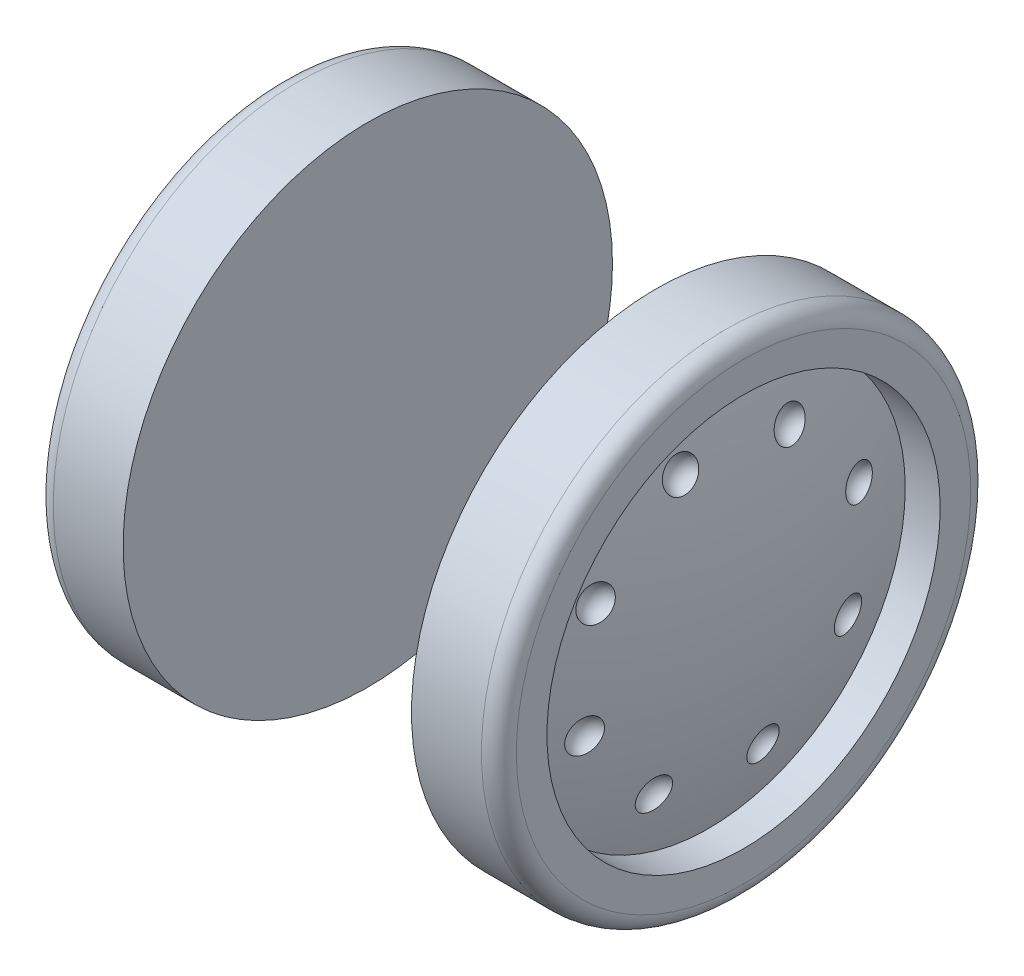
ISO-10303-21;
HEADER;
FILE_DESCRIPTION(('STEP AP214'),'2;1');
FILE_NAME('part.step','',(''),(''),'','','');
FILE_SCHEMA(('AUTOMOTIVE_DESIGN { 1 0 10303 214 1 1 1 1 }'));
ENDSEC;
DATA;
#1=APPLICATION_CONTEXT('core data for automotive mechanical design processes');
#2=APPLICATION_PROTOCOL_DEFINITION('international standard','automotive_design',2000,#1);
#3=PRODUCT_CONTEXT('',#1,'mechanical');
#4=PRODUCT('Part','Part','',(#3));
#5=PRODUCT_RELATED_PRODUCT_CATEGORY('part','',(#4));
#6=PRODUCT_DEFINITION_FORMATION('','',#4);
#7=PRODUCT_DEFINITION_CONTEXT('part definition',#1,'design');
#8=PRODUCT_DEFINITION('design','',#6,#7);
#9=PRODUCT_DEFINITION_SHAPE('','',#8);
#10=(LENGTH_UNIT() NAMED_UNIT(*) SI_UNIT(.MILLI.,.METRE.));
#11=(NAMED_UNIT(*) PLANE_ANGLE_UNIT() SI_UNIT($,.RADIAN.));
#12=(NAMED_UNIT(*) SI_UNIT($,.STERADIAN.) SOLID_ANGLE_UNIT());
#13=UNCERTAINTY_MEASURE_WITH_UNIT(LENGTH_MEASURE(1.E-05),#10,'distance_accuracy_value','');
#14=(GEOMETRIC_REPRESENTATION_CONTEXT(3) GLOBAL_UNCERTAINTY_ASSIGNED_CONTEXT((#13)) GLOBAL_UNIT_ASSIGNED_CONTEXT((#10,
#11,#12)) REPRESENTATION_CONTEXT('',''));
#15=CARTESIAN_POINT('',(0.,0.,0.));
#16=DIRECTION('',(0.,0.,1.));
#17=DIRECTION('',(1.,0.,0.));
#18=AXIS2_PLACEMENT_3D('',#15,#16,#17);
#19=CARTESIAN_POINT('',(-37.8646186680398,-132.5,29.25));
#20=DIRECTION('',(-1.,0.,0.));
#21=DIRECTION('',(0.,0.,-1.));
#22=AXIS2_PLACEMENT_3D('',#19,#20,#21);
#23=SPHERICAL_SURFACE('',#22,40.);
#24=CARTESIAN_POINT('',(-77.0034780050945,-124.64806799323,31.6080273950078));
#25=DIRECTION('',(0.978757983461045,-0.196355777030629,-0.0589679458516745));
#26=DIRECTION('',(0.196698055907386,0.980464111939981,0.));
#27=AXIS2_PLACEMENT_3D('',#24,#25,#26);
#28=CIRCLE('',#27,0.967760486738334);
#29=CARTESIAN_POINT('',(-76.8131213987691,-123.699213567029,31.6080273950078));
#30=VERTEX_POINT('',#29);
#31=EDGE_CURVE('E73',#30,#30,#28,.F.);
#32=ORIENTED_EDGE('',*,*,#31,.F.);
#33=EDGE_LOOP('',(#32));
#34=FACE_BOUND('',#33,.T.);
#35=CARTESIAN_POINT('',(-77.0034780050945,-136.384777206169,22.0304684713632));
#36=DIRECTION('',(0.978757983461045,0.0971478670791499,0.180541135847873));
#37=DIRECTION('',(0.181399161260212,0.,-0.983409550642097));
#38=AXIS2_PLACEMENT_3D('',#35,#36,#37);
#39=CIRCLE('',#38,0.967760486738334);
#40=CARTESIAN_POINT('',(-76.8279270644994,-136.384777206169,21.0787635659707));
#41=VERTEX_POINT('',#40);
#42=EDGE_CURVE('E79',#41,#41,#39,.F.);
#43=ORIENTED_EDGE('',*,*,#42,.F.);
#44=EDGE_LOOP('',(#43));
#45=FACE_BOUND('',#44,.T.);
#46=CARTESIAN_POINT('',(-77.0034780050945,-139.719531528637,33.1347772061694));
#47=DIRECTION('',(0.978757983461045,0.180541135847872,-0.0971478670791518));
#48=DIRECTION('',(-0.181399161260212,0.983409550642097,0.));
#49=AXIS2_PLACEMENT_3D('',#46,#47,#48);
#50=CIRCLE('',#49,0.967760486738334);
#51=CARTESIAN_POINT('',(-77.1790289456896,-138.767826623244,33.1347772061694));
#52=VERTEX_POINT('',#51);
#53=EDGE_CURVE('E85',#52,#52,#50,.F.);
#54=ORIENTED_EDGE('',*,*,#53,.F.);
#55=EDGE_LOOP('',(#54));
#56=FACE_BOUND('',#55,.T.);
#57=CARTESIAN_POINT('',(-77.0034780050945,-128.615222793831,36.4695315286368));
#58=DIRECTION('',(0.978757983461045,-0.0971478670791512,-0.180541135847873));
#59=DIRECTION('',(-0.181399161260212,0.,-0.983409550642097));
#60=AXIS2_PLACEMENT_3D('',#57,#58,#59);
#61=CIRCLE('',#60,0.967760486738334);
#62=CARTESIAN_POINT('',(-77.1790289456896,-128.615222793831,35.5178266232443));
#63=VERTEX_POINT('',#62);
#64=EDGE_CURVE('E91',#63,#63,#61,.F.);
#65=ORIENTED_EDGE('',*,*,#64,.F.);
#66=EDGE_LOOP('',(#65));
#67=FACE_BOUND('',#66,.T.);
#68=CARTESIAN_POINT('',(-76.25,-132.5,29.25));
#69=DIRECTION('',(1.,0.,0.));
#70=DIRECTION('',(0.,0.,-1.));
#71=AXIS2_PLACEMENT_3D('',#68,#69,#70);
#72=CIRCLE('',#71,11.25);
#73=CARTESIAN_POINT('',(-76.25,-132.5,18.));
#74=VERTEX_POINT('',#73);
#75=EDGE_CURVE('E72',#74,#74,#72,.T.);
#76=ORIENTED_EDGE('',*,*,#75,.F.);
#77=EDGE_LOOP('',(#76));
#78=FACE_BOUND('',#77,.T.);
#79=CARTESIAN_POINT('',(-77.0034780050945,-134.858027395008,37.1019320067704));
#80=DIRECTION('',(0.978757983461045,0.0589679458516754,-0.196355777030629));
#81=DIRECTION('',(-0.196698055907386,0.,-0.980464111939981));
#82=AXIS2_PLACEMENT_3D('',#79,#80,#81);
#83=CIRCLE('',#82,0.967760486738334);
#84=CARTESIAN_POINT('',(-77.1938346114199,-134.858027395008,36.1530775805699));
#85=VERTEX_POINT('',#84);
#86=EDGE_CURVE('E88',#85,#85,#83,.F.);
#87=ORIENTED_EDGE('',*,*,#86,.F.);
#88=EDGE_LOOP('',(#87));
#89=FACE_BOUND('',#88,.T.);
#90=CARTESIAN_POINT('',(-77.0034780050945,-140.35193200677,26.8919726049921));
#91=DIRECTION('',(0.978757983461045,0.196355777030629,0.0589679458516762));
#92=DIRECTION('',(-0.196698055907386,0.980464111939981,0.));
#93=AXIS2_PLACEMENT_3D('',#90,#91,#92);
#94=CIRCLE('',#93,0.967760486738334);
#95=CARTESIAN_POINT('',(-77.1938346114199,-139.40307758057,26.8919726049921));
#96=VERTEX_POINT('',#95);
#97=EDGE_CURVE('E82',#96,#96,#94,.F.);
#98=ORIENTED_EDGE('',*,*,#97,.F.);
#99=EDGE_LOOP('',(#98));
#100=FACE_BOUND('',#99,.T.);
#101=CARTESIAN_POINT('',(-77.0034780050945,-125.280468471363,25.3652227938306));
#102=DIRECTION('',(0.978757983461045,-0.180541135847872,0.097147867079152));
#103=DIRECTION('',(0.181399161260212,0.983409550642097,0.));
#104=AXIS2_PLACEMENT_3D('',#101,#102,#103);
#105=CIRCLE('',#104,0.967760486738334);
#106=CARTESIAN_POINT('',(-76.8279270644994,-124.328763565971,25.3652227938306));
#107=VERTEX_POINT('',#106);
#108=EDGE_CURVE('E76',#107,#107,#105,.F.);
#109=ORIENTED_EDGE('',*,*,#108,.F.);
#110=EDGE_LOOP('',(#109));
#111=FACE_BOUND('',#110,.T.);
#112=CARTESIAN_POINT('',(-77.0034780050945,-130.141972604992,21.3980679932296));
#113=DIRECTION('',(0.978757983461045,-0.0589679458516767,0.196355777030629));
#114=DIRECTION('',(0.196698055907385,0.,-0.980464111939981));
#115=AXIS2_PLACEMENT_3D('',#112,#113,#114);
#116=CIRCLE('',#115,0.967760486738334);
#117=CARTESIAN_POINT('',(-76.8131213987691,-130.141972604992,20.4492135670291));
#118=VERTEX_POINT('',#117);
#119=EDGE_CURVE('E69',#118,#118,#116,.F.);
#120=ORIENTED_EDGE('',*,*,#119,.F.);
#121=EDGE_LOOP('',(#120));
#122=FACE_BOUND('',#121,.T.);
#123=ADVANCED_FACE('F51',(#34,#45,#56,#67,#78,#89,#100,#111,#122),#23,.T.);
#124=CARTESIAN_POINT('',(-76.25,-132.5,29.25));
#125=DIRECTION('',(1.,0.,0.));
#126=DIRECTION('',(0.,0.,1.));
#127=AXIS2_PLACEMENT_3D('',#124,#125,#126);
#128=CYLINDRICAL_SURFACE('',#127,14.);
#129=CARTESIAN_POINT('',(-77.25,-132.5,29.25));
#130=DIRECTION('',(1.,0.,0.));
#131=DIRECTION('',(0.,0.,-1.));
#132=AXIS2_PLACEMENT_3D('',#129,#130,#131);
#133=CIRCLE('',#132,14.);
#134=CARTESIAN_POINT('',(-77.25,-132.5,15.25));
#135=VERTEX_POINT('',#134);
#136=EDGE_CURVE('E11',#135,#135,#133,.F.);
#137=ORIENTED_EDGE('',*,*,#136,.F.);
#138=EDGE_LOOP('',(#137));
#139=FACE_BOUND('',#138,.T.);
#140=CARTESIAN_POINT('',(-73.25,-132.5,29.25));
#141=DIRECTION('',(1.,0.,0.));
#142=DIRECTION('',(0.,0.,-1.));
#143=AXIS2_PLACEMENT_3D('',#140,#141,#142);
#144=CIRCLE('',#143,14.);
#145=CARTESIAN_POINT('',(-73.25,-132.5,15.25));
#146=VERTEX_POINT('',#145);
#147=EDGE_CURVE('E62',#146,#146,#144,.T.);
#148=ORIENTED_EDGE('',*,*,#147,.F.);
#149=EDGE_LOOP('',(#148));
#150=FACE_BOUND('',#149,.T.);
#151=ADVANCED_FACE('F103',(#139,#150),#128,.T.);
#152=CARTESIAN_POINT('',(-73.25,-132.5,29.25));
#153=DIRECTION('',(-1.,0.,0.));
#154=DIRECTION('',(0.,0.,-1.));
#155=AXIS2_PLACEMENT_3D('',#152,#153,#154);
#156=PLANE('',#155);
#157=ORIENTED_EDGE('',*,*,#147,.T.);
#158=EDGE_LOOP('',(#157));
#159=FACE_BOUND('',#158,.T.);
#160=ADVANCED_FACE('F139',(#159),#156,.F.);
#161=CARTESIAN_POINT('',(-78.25,-132.5,29.25));
#162=DIRECTION('',(-1.,0.,0.));
#163=DIRECTION('',(0.,0.,-1.));
#164=AXIS2_PLACEMENT_3D('',#161,#162,#163);
#165=PLANE('',#164);
#166=CARTESIAN_POINT('',(-78.25,-132.5,29.25));
#167=DIRECTION('',(1.,0.,0.));
#168=DIRECTION('',(0.,0.,-1.));
#169=AXIS2_PLACEMENT_3D('',#166,#167,#168);
#170=CIRCLE('',#169,13.);
#171=CARTESIAN_POINT('',(-78.25,-132.5,16.25));
#172=VERTEX_POINT('',#171);
#173=EDGE_CURVE('E58',#172,#172,#170,.T.);
#174=ORIENTED_EDGE('',*,*,#173,.F.);
#175=EDGE_LOOP('',(#174));
#176=FACE_BOUND('',#175,.T.);
#177=CARTESIAN_POINT('',(-78.25,-132.5,29.25));
#178=DIRECTION('',(1.,0.,0.));
#179=DIRECTION('',(0.,0.,-1.));
#180=AXIS2_PLACEMENT_3D('',#177,#178,#179);
#181=CIRCLE('',#180,11.25);
#182=CARTESIAN_POINT('',(-78.25,-132.5,18.));
#183=VERTEX_POINT('',#182);
#184=EDGE_CURVE('E66',#183,#183,#181,.T.);
#185=ORIENTED_EDGE('',*,*,#184,.T.);
#186=EDGE_LOOP('',(#185));
#187=FACE_BOUND('',#186,.T.);
#188=ADVANCED_FACE('F135',(#176,#187),#165,.T.);
#189=CARTESIAN_POINT('',(-78.25,-132.5,29.25));
#190=DIRECTION('',(1.,0.,0.));
#191=DIRECTION('',(0.,0.,1.));
#192=AXIS2_PLACEMENT_3D('',#189,#190,#191);
#193=CYLINDRICAL_SURFACE('',#192,11.25);
#194=ORIENTED_EDGE('',*,*,#184,.F.);
#195=EDGE_LOOP('',(#194));
#196=FACE_BOUND('',#195,.T.);
#197=ORIENTED_EDGE('',*,*,#75,.T.);
#198=EDGE_LOOP('',(#197));
#199=FACE_BOUND('',#198,.T.);
#200=ADVANCED_FACE('F99',(#196,#199),#193,.F.);
#201=CARTESIAN_POINT('',(-77.25,-128.590753940041,36.5150048343199));
#202=DIRECTION('',(0.,-0.473848007267811,-0.880606646584231));
#203=DIRECTION('',(0.,-0.880606646584231,0.473848007267811));
#204=AXIS2_PLACEMENT_3D('',#201,#202,#203);
#205=SPHERICAL_SURFACE('',#204,1.);
#206=CARTESIAN_POINT('',(-77.25,-128.590753940041,36.5150048343199));
#207=DIRECTION('',(0.978757983461045,-0.0971478670791512,-0.180541135847873));
#208=DIRECTION('',(-0.181399161260212,0.,-0.983409550642097));
#209=AXIS2_PLACEMENT_3D('',#206,#207,#208);
#210=SPHERICAL_SURFACE('',#209,1.);
#211=ORIENTED_EDGE('',*,*,#64,.T.);
#212=EDGE_LOOP('',(#211));
#213=FACE_BOUND('',#212,.T.);
#214=ADVANCED_FACE('F128',(#213),#210,.F.);
#215=CARTESIAN_POINT('',(-77.25,-134.872879785377,37.1513885820248));
#216=DIRECTION('',(0.,0.287621792166855,-0.957744070548456));
#217=DIRECTION('',(0.,-0.957744070548456,-0.287621792166855));
#218=AXIS2_PLACEMENT_3D('',#215,#216,#217);
#219=SPHERICAL_SURFACE('',#218,1.);
#220=CARTESIAN_POINT('',(-77.25,-134.872879785377,37.1513885820248));
#221=DIRECTION('',(0.978757983461045,0.0589679458516754,-0.196355777030629));
#222=DIRECTION('',(-0.196698055907386,0.,-0.980464111939981));
#223=AXIS2_PLACEMENT_3D('',#220,#221,#222);
#224=SPHERICAL_SURFACE('',#223,1.);
#225=ORIENTED_EDGE('',*,*,#86,.T.);
#226=EDGE_LOOP('',(#225));
#227=FACE_BOUND('',#226,.T.);
#228=ADVANCED_FACE('F130',(#227),#224,.F.);
#229=CARTESIAN_POINT('',(-77.25,-139.76500483432,33.1592460599595));
#230=DIRECTION('',(0.,0.880606646584229,-0.473848007267814));
#231=DIRECTION('',(0.,-0.473848007267814,-0.880606646584229));
#232=AXIS2_PLACEMENT_3D('',#229,#230,#231);
#233=SPHERICAL_SURFACE('',#232,1.);
#234=CARTESIAN_POINT('',(-77.25,-139.76500483432,33.1592460599595));
#235=DIRECTION('',(0.978757983461045,0.180541135847872,-0.0971478670791518));
#236=DIRECTION('',(-0.181399161260212,0.983409550642097,0.));
#237=AXIS2_PLACEMENT_3D('',#234,#235,#236);
#238=SPHERICAL_SURFACE('',#237,1.);
#239=ORIENTED_EDGE('',*,*,#53,.T.);
#240=EDGE_LOOP('',(#239));
#241=FACE_BOUND('',#240,.T.);
#242=ADVANCED_FACE('F173',(#241),#238,.F.);
#243=CARTESIAN_POINT('',(-77.25,-140.401388582025,26.8771202146234));
#244=DIRECTION('',(0.,0.957744070548455,0.287621792166859));
#245=DIRECTION('',(0.,0.287621792166859,-0.957744070548455));
#246=AXIS2_PLACEMENT_3D('',#243,#244,#245);
#247=SPHERICAL_SURFACE('',#246,1.);
#248=CARTESIAN_POINT('',(-77.25,-140.401388582025,26.8771202146234));
#249=DIRECTION('',(0.978757983461045,0.196355777030629,0.0589679458516762));
#250=DIRECTION('',(-0.196698055907386,0.980464111939981,0.));
#251=AXIS2_PLACEMENT_3D('',#248,#249,#250);
#252=SPHERICAL_SURFACE('',#251,1.);
#253=ORIENTED_EDGE('',*,*,#97,.T.);
#254=EDGE_LOOP('',(#253));
#255=FACE_BOUND('',#254,.T.);
#256=ADVANCED_FACE('F181',(#255),#252,.F.);
#257=CARTESIAN_POINT('',(-77.25,-136.409246059959,21.9849951656801));
#258=DIRECTION('',(0.,0.473848007267805,0.880606646584234));
#259=DIRECTION('',(0.,0.880606646584234,-0.473848007267805));
#260=AXIS2_PLACEMENT_3D('',#257,#258,#259);
#261=SPHERICAL_SURFACE('',#260,1.);
#262=CARTESIAN_POINT('',(-77.25,-136.409246059959,21.9849951656801));
#263=DIRECTION('',(0.978757983461045,0.0971478670791499,0.180541135847873));
#264=DIRECTION('',(0.181399161260212,0.,-0.983409550642097));
#265=AXIS2_PLACEMENT_3D('',#262,#263,#264);
#266=SPHERICAL_SURFACE('',#265,1.);
#267=ORIENTED_EDGE('',*,*,#42,.T.);
#268=EDGE_LOOP('',(#267));
#269=FACE_BOUND('',#268,.T.);
#270=ADVANCED_FACE('F189',(#269),#266,.F.);
#271=CARTESIAN_POINT('',(-77.25,-125.23499516568,25.3407539400405));
#272=DIRECTION('',(0.,-0.880606646584229,0.473848007267814));
#273=DIRECTION('',(0.,0.473848007267814,0.880606646584229));
#274=AXIS2_PLACEMENT_3D('',#271,#272,#273);
#275=SPHERICAL_SURFACE('',#274,1.);
#276=CARTESIAN_POINT('',(-77.25,-125.23499516568,25.3407539400405));
#277=DIRECTION('',(0.978757983461045,-0.180541135847872,0.097147867079152));
#278=DIRECTION('',(0.181399161260212,0.983409550642097,0.));
#279=AXIS2_PLACEMENT_3D('',#276,#277,#278);
#280=SPHERICAL_SURFACE('',#279,1.);
#281=ORIENTED_EDGE('',*,*,#108,.T.);
#282=EDGE_LOOP('',(#281));
#283=FACE_BOUND('',#282,.T.);
#284=ADVANCED_FACE('F122',(#283),#280,.F.);
#285=CARTESIAN_POINT('',(-77.25,-124.598611417975,31.6228797853765));
#286=DIRECTION('',(0.,-0.957744070548457,-0.287621792166852));
#287=DIRECTION('',(0.,-0.287621792166852,0.957744070548457));
#288=AXIS2_PLACEMENT_3D('',#285,#286,#287);
#289=SPHERICAL_SURFACE('',#288,1.);
#290=CARTESIAN_POINT('',(-77.25,-124.598611417975,31.6228797853765));
#291=DIRECTION('',(0.978757983461045,-0.196355777030629,-0.0589679458516745));
#292=DIRECTION('',(0.196698055907386,0.980464111939981,0.));
#293=AXIS2_PLACEMENT_3D('',#290,#291,#292);
#294=SPHERICAL_SURFACE('',#293,1.);
#295=ORIENTED_EDGE('',*,*,#31,.T.);
#296=EDGE_LOOP('',(#295));
#297=FACE_BOUND('',#296,.T.);
#298=ADVANCED_FACE('F116',(#297),#294,.F.);
#299=CARTESIAN_POINT('',(-77.25,-130.127120214623,21.3486114179753));
#300=DIRECTION('',(0.,-0.287621792166862,0.957744070548454));
#301=DIRECTION('',(0.,0.957744070548454,0.287621792166862));
#302=AXIS2_PLACEMENT_3D('',#299,#300,#301);
#303=SPHERICAL_SURFACE('',#302,1.);
#304=CARTESIAN_POINT('',(-77.25,-130.127120214623,21.3486114179753));
#305=DIRECTION('',(0.978757983461045,-0.0589679458516768,0.196355777030629));
#306=DIRECTION('',(0.196698055907385,0.,-0.980464111939981));
#307=AXIS2_PLACEMENT_3D('',#304,#305,#306);
#308=SPHERICAL_SURFACE('',#307,1.);
#309=ORIENTED_EDGE('',*,*,#119,.T.);
#310=EDGE_LOOP('',(#309));
#311=FACE_BOUND('',#310,.T.);
#312=ADVANCED_FACE('F114',(#311),#308,.F.);
#313=CARTESIAN_POINT('',(-77.25,-132.5,29.25));
#314=DIRECTION('',(-1.,0.,0.));
#315=DIRECTION('',(0.,0.,-1.));
#316=AXIS2_PLACEMENT_3D('',#313,#314,#315);
#317=TOROIDAL_SURFACE('',#316,13.,1.);
#318=ORIENTED_EDGE('',*,*,#136,.T.);
#319=EDGE_LOOP('',(#318));
#320=FACE_BOUND('',#319,.T.);
#321=ORIENTED_EDGE('',*,*,#173,.T.);
#322=EDGE_LOOP('',(#321));
#323=FACE_BOUND('',#322,.T.);
#324=ADVANCED_FACE('F53',(#320,#323),#317,.T.);
#325=CLOSED_SHELL('',(#123,#151,#160,#188,#200,#214,#228,#242,#256,#270,#284,#298,#312,#324));
#326=MANIFOLD_SOLID_BREP('B2',#325);
#327=CARTESIAN_POINT('',(-92.1353813319602,-132.5,29.25));
#328=DIRECTION('',(1.,0.,0.));
#329=DIRECTION('',(0.,0.,-1.));
#330=AXIS2_PLACEMENT_3D('',#327,#328,#329);
#331=SPHERICAL_SURFACE('',#330,40.);
#332=CARTESIAN_POINT('',(-52.9965219949055,-124.64806799323,31.6080273950078));
#333=DIRECTION('',(0.978757983461045,0.196355777030629,0.0589679458516745));
#334=DIRECTION('',(-0.196698055907386,0.980464111939981,0.));
#335=AXIS2_PLACEMENT_3D('',#332,#333,#334);
#336=CIRCLE('',#335,0.967760486738334);
#337=CARTESIAN_POINT('',(-53.1868786012309,-123.699213567029,31.6080273950078));
#338=VERTEX_POINT('',#337);
#339=EDGE_CURVE('E319',#338,#338,#336,.F.);
#340=ORIENTED_EDGE('',*,*,#339,.T.);
#341=EDGE_LOOP('',(#340));
#342=FACE_BOUND('',#341,.T.);
#343=CARTESIAN_POINT('',(-52.9965219949055,-136.384777206169,22.0304684713632));
#344=DIRECTION('',(0.978757983461045,-0.0971478670791499,-0.180541135847873));
#345=DIRECTION('',(-0.181399161260212,0.,-0.983409550642097));
#346=AXIS2_PLACEMENT_3D('',#343,#344,#345);
#347=CIRCLE('',#346,0.967760486738334);
#348=CARTESIAN_POINT('',(-53.1720729355006,-136.384777206169,21.0787635659707));
#349=VERTEX_POINT('',#348);
#350=EDGE_CURVE('E325',#349,#349,#347,.F.);
#351=ORIENTED_EDGE('',*,*,#350,.T.);
#352=EDGE_LOOP('',(#351));
#353=FACE_BOUND('',#352,.T.);
#354=CARTESIAN_POINT('',(-52.9965219949055,-139.719531528637,33.1347772061694));
#355=DIRECTION('',(0.978757983461045,-0.180541135847872,0.0971478670791518));
#356=DIRECTION('',(0.181399161260212,0.983409550642097,0.));
#357=AXIS2_PLACEMENT_3D('',#354,#355,#356);
#358=CIRCLE('',#357,0.967760486738334);
#359=CARTESIAN_POINT('',(-52.8209710543104,-138.767826623244,33.1347772061694));
#360=VERTEX_POINT('',#359);
#361=EDGE_CURVE('E331',#360,#360,#358,.F.);
#362=ORIENTED_EDGE('',*,*,#361,.T.);
#363=EDGE_LOOP('',(#362));
#364=FACE_BOUND('',#363,.T.);
#365=CARTESIAN_POINT('',(-52.9965219949055,-128.615222793831,36.4695315286368));
#366=DIRECTION('',(0.978757983461045,0.0971478670791512,0.180541135847873));
#367=DIRECTION('',(0.181399161260212,0.,-0.983409550642097));
#368=AXIS2_PLACEMENT_3D('',#365,#366,#367);
#369=CIRCLE('',#368,0.967760486738334);
#370=CARTESIAN_POINT('',(-52.8209710543104,-128.615222793831,35.5178266232443));
#371=VERTEX_POINT('',#370);
#372=EDGE_CURVE('E337',#371,#371,#369,.F.);
#373=ORIENTED_EDGE('',*,*,#372,.T.);
#374=EDGE_LOOP('',(#373));
#375=FACE_BOUND('',#374,.T.);
#376=CARTESIAN_POINT('',(-53.75,-132.5,29.25));
#377=DIRECTION('',(1.,0.,0.));
#378=DIRECTION('',(0.,0.,-1.));
#379=AXIS2_PLACEMENT_3D('',#376,#377,#378);
#380=CIRCLE('',#379,11.25);
#381=CARTESIAN_POINT('',(-53.75,-132.5,18.));
#382=VERTEX_POINT('',#381);
#383=EDGE_CURVE('E318',#382,#382,#380,.T.);
#384=ORIENTED_EDGE('',*,*,#383,.T.);
#385=EDGE_LOOP('',(#384));
#386=FACE_BOUND('',#385,.T.);
#387=CARTESIAN_POINT('',(-52.9965219949055,-134.858027395008,37.1019320067704));
#388=DIRECTION('',(0.978757983461045,-0.0589679458516754,0.196355777030629));
#389=DIRECTION('',(0.196698055907386,0.,-0.980464111939981));
#390=AXIS2_PLACEMENT_3D('',#387,#388,#389);
#391=CIRCLE('',#390,0.967760486738334);
#392=CARTESIAN_POINT('',(-52.8061653885801,-134.858027395008,36.1530775805699));
#393=VERTEX_POINT('',#392);
#394=EDGE_CURVE('E334',#393,#393,#391,.F.);
#395=ORIENTED_EDGE('',*,*,#394,.T.);
#396=EDGE_LOOP('',(#395));
#397=FACE_BOUND('',#396,.T.);
#398=CARTESIAN_POINT('',(-52.9965219949055,-140.35193200677,26.8919726049921));
#399=DIRECTION('',(0.978757983461045,-0.196355777030629,-0.0589679458516762));
#400=DIRECTION('',(0.196698055907386,0.980464111939981,0.));
#401=AXIS2_PLACEMENT_3D('',#398,#399,#400);
#402=CIRCLE('',#401,0.967760486738334);
#403=CARTESIAN_POINT('',(-52.8061653885801,-139.40307758057,26.8919726049921));
#404=VERTEX_POINT('',#403);
#405=EDGE_CURVE('E328',#404,#404,#402,.F.);
#406=ORIENTED_EDGE('',*,*,#405,.T.);
#407=EDGE_LOOP('',(#406));
#408=FACE_BOUND('',#407,.T.);
#409=CARTESIAN_POINT('',(-52.9965219949055,-125.280468471363,25.3652227938306));
#410=DIRECTION('',(0.978757983461045,0.180541135847872,-0.097147867079152));
#411=DIRECTION('',(-0.181399161260212,0.983409550642097,0.));
#412=AXIS2_PLACEMENT_3D('',#409,#410,#411);
#413=CIRCLE('',#412,0.967760486738334);
#414=CARTESIAN_POINT('',(-53.1720729355006,-124.328763565971,25.3652227938306));
#415=VERTEX_POINT('',#414);
#416=EDGE_CURVE('E322',#415,#415,#413,.F.);
#417=ORIENTED_EDGE('',*,*,#416,.T.);
#418=EDGE_LOOP('',(#417));
#419=FACE_BOUND('',#418,.T.);
#420=CARTESIAN_POINT('',(-52.9965219949055,-130.141972604992,21.3980679932296));
#421=DIRECTION('',(0.978757983461045,0.0589679458516767,-0.196355777030629));
#422=DIRECTION('',(-0.196698055907385,0.,-0.980464111939981));
#423=AXIS2_PLACEMENT_3D('',#420,#421,#422);
#424=CIRCLE('',#423,0.967760486738334);
#425=CARTESIAN_POINT('',(-53.1868786012309,-130.141972604992,20.4492135670291));
#426=VERTEX_POINT('',#425);
#427=EDGE_CURVE('E315',#426,#426,#424,.F.);
#428=ORIENTED_EDGE('',*,*,#427,.T.);
#429=EDGE_LOOP('',(#428));
#430=FACE_BOUND('',#429,.T.);
#431=ADVANCED_FACE('F297',(#342,#353,#364,#375,#386,#397,#408,#419,#430),#331,.T.);
#432=CARTESIAN_POINT('',(-53.75,-132.5,29.25));
#433=DIRECTION('',(-1.,0.,0.));
#434=DIRECTION('',(0.,0.,1.));
#435=AXIS2_PLACEMENT_3D('',#432,#433,#434);
#436=CYLINDRICAL_SURFACE('',#435,14.);
#437=CARTESIAN_POINT('',(-52.75,-132.5,29.25));
#438=DIRECTION('',(1.,0.,0.));
#439=DIRECTION('',(0.,0.,-1.));
#440=AXIS2_PLACEMENT_3D('',#437,#438,#439);
#441=CIRCLE('',#440,14.);
#442=CARTESIAN_POINT('',(-52.75,-132.5,15.25));
#443=VERTEX_POINT('',#442);
#444=EDGE_CURVE('E50',#443,#443,#441,.F.);
#445=ORIENTED_EDGE('',*,*,#444,.T.);
#446=EDGE_LOOP('',(#445));
#447=FACE_BOUND('',#446,.T.);
#448=CARTESIAN_POINT('',(-56.75,-132.5,29.25));
#449=DIRECTION('',(1.,0.,0.));
#450=DIRECTION('',(0.,0.,-1.));
#451=AXIS2_PLACEMENT_3D('',#448,#449,#450);
#452=CIRCLE('',#451,14.);
#453=CARTESIAN_POINT('',(-56.75,-132.5,15.25));
#454=VERTEX_POINT('',#453);
#455=EDGE_CURVE('E308',#454,#454,#452,.T.);
#456=ORIENTED_EDGE('',*,*,#455,.T.);
#457=EDGE_LOOP('',(#456));
#458=FACE_BOUND('',#457,.T.);
#459=ADVANCED_FACE('F364',(#447,#458),#436,.T.);
#460=CARTESIAN_POINT('',(-56.75,-132.5,29.25));
#461=DIRECTION('',(1.,0.,0.));
#462=DIRECTION('',(0.,0.,-1.));
#463=AXIS2_PLACEMENT_3D('',#460,#461,#462);
#464=PLANE('',#463);
#465=ORIENTED_EDGE('',*,*,#455,.F.);
#466=EDGE_LOOP('',(#465));
#467=FACE_BOUND('',#466,.T.);
#468=ADVANCED_FACE('F360',(#467),#464,.F.);
#469=CARTESIAN_POINT('',(-51.75,-132.5,29.25));
#470=DIRECTION('',(1.,0.,0.));
#471=DIRECTION('',(0.,0.,-1.));
#472=AXIS2_PLACEMENT_3D('',#469,#470,#471);
#473=PLANE('',#472);
#474=CARTESIAN_POINT('',(-51.75,-132.5,29.25));
#475=DIRECTION('',(1.,0.,0.));
#476=DIRECTION('',(0.,0.,-1.));
#477=AXIS2_PLACEMENT_3D('',#474,#475,#476);
#478=CIRCLE('',#477,13.);
#479=CARTESIAN_POINT('',(-51.75,-132.5,16.25));
#480=VERTEX_POINT('',#479);
#481=EDGE_CURVE('E304',#480,#480,#478,.T.);
#482=ORIENTED_EDGE('',*,*,#481,.T.);
#483=EDGE_LOOP('',(#482));
#484=FACE_BOUND('',#483,.T.);
#485=CARTESIAN_POINT('',(-51.75,-132.5,29.25));
#486=DIRECTION('',(1.,0.,0.));
#487=DIRECTION('',(0.,0.,-1.));
#488=AXIS2_PLACEMENT_3D('',#485,#486,#487);
#489=CIRCLE('',#488,11.25);
#490=CARTESIAN_POINT('',(-51.75,-132.5,18.));
#491=VERTEX_POINT('',#490);
#492=EDGE_CURVE('E312',#491,#491,#489,.T.);
#493=ORIENTED_EDGE('',*,*,#492,.F.);
#494=EDGE_LOOP('',(#493));
#495=FACE_BOUND('',#494,.T.);
#496=ADVANCED_FACE('F350',(#484,#495),#473,.T.);
#497=CARTESIAN_POINT('',(-51.75,-132.5,29.25));
#498=DIRECTION('',(-1.,0.,0.));
#499=DIRECTION('',(0.,0.,1.));
#500=AXIS2_PLACEMENT_3D('',#497,#498,#499);
#501=CYLINDRICAL_SURFACE('',#500,11.25);
#502=ORIENTED_EDGE('',*,*,#492,.T.);
#503=EDGE_LOOP('',(#502));
#504=FACE_BOUND('',#503,.T.);
#505=ORIENTED_EDGE('',*,*,#383,.F.);
#506=EDGE_LOOP('',(#505));
#507=FACE_BOUND('',#506,.T.);
#508=ADVANCED_FACE('F347',(#504,#507),#501,.F.);
#509=CARTESIAN_POINT('',(-52.75,-128.590753940041,36.5150048343199));
#510=DIRECTION('',(0.,-0.473848007267811,-0.880606646584231));
#511=DIRECTION('',(0.,-0.880606646584231,0.473848007267811));
#512=AXIS2_PLACEMENT_3D('',#509,#510,#511);
#513=SPHERICAL_SURFACE('',#512,1.);
#514=CARTESIAN_POINT('',(-52.75,-128.590753940041,36.5150048343199));
#515=DIRECTION('',(0.978757983461045,0.0971478670791512,0.180541135847873));
#516=DIRECTION('',(0.181399161260212,0.,-0.983409550642097));
#517=AXIS2_PLACEMENT_3D('',#514,#515,#516);
#518=SPHERICAL_SURFACE('',#517,1.);
#519=ORIENTED_EDGE('',*,*,#372,.F.);
#520=EDGE_LOOP('',(#519));
#521=FACE_BOUND('',#520,.T.);
#522=ADVANCED_FACE('F349',(#521),#518,.F.);
#523=CARTESIAN_POINT('',(-52.75,-134.872879785377,37.1513885820248));
#524=DIRECTION('',(0.,0.287621792166855,-0.957744070548456));
#525=DIRECTION('',(0.,-0.957744070548456,-0.287621792166855));
#526=AXIS2_PLACEMENT_3D('',#523,#524,#525);
#527=SPHERICAL_SURFACE('',#526,1.);
#528=CARTESIAN_POINT('',(-52.75,-134.872879785377,37.1513885820248));
#529=DIRECTION('',(0.978757983461045,-0.0589679458516754,0.196355777030629));
#530=DIRECTION('',(0.196698055907386,0.,-0.980464111939981));
#531=AXIS2_PLACEMENT_3D('',#528,#529,#530);
#532=SPHERICAL_SURFACE('',#531,1.);
#533=ORIENTED_EDGE('',*,*,#394,.F.);
#534=EDGE_LOOP('',(#533));
#535=FACE_BOUND('',#534,.T.);
#536=ADVANCED_FACE('F357',(#535),#532,.F.);
#537=CARTESIAN_POINT('',(-52.75,-139.76500483432,33.1592460599595));
#538=DIRECTION('',(0.,0.880606646584229,-0.473848007267814));
#539=DIRECTION('',(0.,-0.473848007267814,-0.880606646584229));
#540=AXIS2_PLACEMENT_3D('',#537,#538,#539);
#541=SPHERICAL_SURFACE('',#540,1.);
#542=CARTESIAN_POINT('',(-52.75,-139.76500483432,33.1592460599595));
#543=DIRECTION('',(0.978757983461045,-0.180541135847872,0.0971478670791518));
#544=DIRECTION('',(0.181399161260212,0.983409550642097,0.));
#545=AXIS2_PLACEMENT_3D('',#542,#543,#544);
#546=SPHERICAL_SURFACE('',#545,1.);
#547=ORIENTED_EDGE('',*,*,#361,.F.);
#548=EDGE_LOOP('',(#547));
#549=FACE_BOUND('',#548,.T.);
#550=ADVANCED_FACE('F390',(#549),#546,.F.);
#551=CARTESIAN_POINT('',(-52.75,-140.401388582025,26.8771202146234));
#552=DIRECTION('',(0.,0.957744070548455,0.287621792166859));
#553=DIRECTION('',(0.,0.287621792166859,-0.957744070548455));
#554=AXIS2_PLACEMENT_3D('',#551,#552,#553);
#555=SPHERICAL_SURFACE('',#554,1.);
#556=CARTESIAN_POINT('',(-52.75,-140.401388582025,26.8771202146234));
#557=DIRECTION('',(0.978757983461045,-0.196355777030629,-0.0589679458516762));
#558=DIRECTION('',(0.196698055907386,0.980464111939981,0.));
#559=AXIS2_PLACEMENT_3D('',#556,#557,#558);
#560=SPHERICAL_SURFACE('',#559,1.);
#561=ORIENTED_EDGE('',*,*,#405,.F.);
#562=EDGE_LOOP('',(#561));
#563=FACE_BOUND('',#562,.T.);
#564=ADVANCED_FACE('F386',(#563),#560,.F.);
#565=CARTESIAN_POINT('',(-52.75,-136.409246059959,21.9849951656801));
#566=DIRECTION('',(0.,0.473848007267805,0.880606646584234));
#567=DIRECTION('',(0.,0.880606646584234,-0.473848007267805));
#568=AXIS2_PLACEMENT_3D('',#565,#566,#567);
#569=SPHERICAL_SURFACE('',#568,1.);
#570=CARTESIAN_POINT('',(-52.75,-136.409246059959,21.9849951656801));
#571=DIRECTION('',(0.978757983461045,-0.0971478670791499,-0.180541135847873));
#572=DIRECTION('',(-0.181399161260212,0.,-0.983409550642097));
#573=AXIS2_PLACEMENT_3D('',#570,#571,#572);
#574=SPHERICAL_SURFACE('',#573,1.);
#575=ORIENTED_EDGE('',*,*,#350,.F.);
#576=EDGE_LOOP('',(#575));
#577=FACE_BOUND('',#576,.T.);
#578=ADVANCED_FACE('F382',(#577),#574,.F.);
#579=CARTESIAN_POINT('',(-52.75,-125.23499516568,25.3407539400405));
#580=DIRECTION('',(0.,-0.880606646584229,0.473848007267814));
#581=DIRECTION('',(0.,0.473848007267814,0.880606646584229));
#582=AXIS2_PLACEMENT_3D('',#579,#580,#581);
#583=SPHERICAL_SURFACE('',#582,1.);
#584=CARTESIAN_POINT('',(-52.75,-125.23499516568,25.3407539400405));
#585=DIRECTION('',(0.978757983461045,0.180541135847872,-0.097147867079152));
#586=DIRECTION('',(-0.181399161260212,0.983409550642097,0.));
#587=AXIS2_PLACEMENT_3D('',#584,#585,#586);
#588=SPHERICAL_SURFACE('',#587,1.);
#589=ORIENTED_EDGE('',*,*,#416,.F.);
#590=EDGE_LOOP('',(#589));
#591=FACE_BOUND('',#590,.T.);
#592=ADVANCED_FACE('F375',(#591),#588,.F.);
#593=CARTESIAN_POINT('',(-52.75,-124.598611417975,31.6228797853765));
#594=DIRECTION('',(0.,-0.957744070548457,-0.287621792166852));
#595=DIRECTION('',(0.,-0.287621792166852,0.957744070548457));
#596=AXIS2_PLACEMENT_3D('',#593,#594,#595);
#597=SPHERICAL_SURFACE('',#596,1.);
#598=CARTESIAN_POINT('',(-52.75,-124.598611417975,31.6228797853765));
#599=DIRECTION('',(0.978757983461045,0.196355777030629,0.0589679458516745));
#600=DIRECTION('',(-0.196698055907386,0.980464111939981,0.));
#601=AXIS2_PLACEMENT_3D('',#598,#599,#600);
#602=SPHERICAL_SURFACE('',#601,1.);
#603=ORIENTED_EDGE('',*,*,#339,.F.);
#604=EDGE_LOOP('',(#603));
#605=FACE_BOUND('',#604,.T.);
#606=ADVANCED_FACE('F371',(#605),#602,.F.);
#607=CARTESIAN_POINT('',(-52.75,-130.127120214623,21.3486114179753));
#608=DIRECTION('',(0.,-0.287621792166862,0.957744070548454));
#609=DIRECTION('',(0.,0.957744070548454,0.287621792166862));
#610=AXIS2_PLACEMENT_3D('',#607,#608,#609);
#611=SPHERICAL_SURFACE('',#610,1.);
#612=CARTESIAN_POINT('',(-52.75,-130.127120214623,21.3486114179753));
#613=DIRECTION('',(0.978757983461045,0.0589679458516768,-0.196355777030629));
#614=DIRECTION('',(-0.196698055907385,0.,-0.980464111939981));
#615=AXIS2_PLACEMENT_3D('',#612,#613,#614);
#616=SPHERICAL_SURFACE('',#615,1.);
#617=ORIENTED_EDGE('',*,*,#427,.F.);
#618=EDGE_LOOP('',(#617));
#619=FACE_BOUND('',#618,.T.);
#620=ADVANCED_FACE('F374',(#619),#616,.F.);
#621=CARTESIAN_POINT('',(-52.75,-132.5,29.25));
#622=DIRECTION('',(1.,0.,0.));
#623=DIRECTION('',(0.,0.,-1.));
#624=AXIS2_PLACEMENT_3D('',#621,#622,#623);
#625=TOROIDAL_SURFACE('',#624,13.,1.);
#626=ORIENTED_EDGE('',*,*,#444,.F.);
#627=EDGE_LOOP('',(#626));
#628=FACE_BOUND('',#627,.T.);
#629=ORIENTED_EDGE('',*,*,#481,.F.);
#630=EDGE_LOOP('',(#629));
#631=FACE_BOUND('',#630,.T.);
#632=ADVANCED_FACE('F299',(#628,#631),#625,.T.);
#633=CLOSED_SHELL('',(#431,#459,#468,#496,#508,#522,#536,#550,#564,#578,#592,#606,#620,#632));
#634=MANIFOLD_SOLID_BREP('B6',#633);
#635=ADVANCED_BREP_SHAPE_REPRESENTATION('',(#18,#326,#634),#14);
#636=SHAPE_DEFINITION_REPRESENTATION(#9,#635);
ENDSEC;
END-ISO-10303-21;
